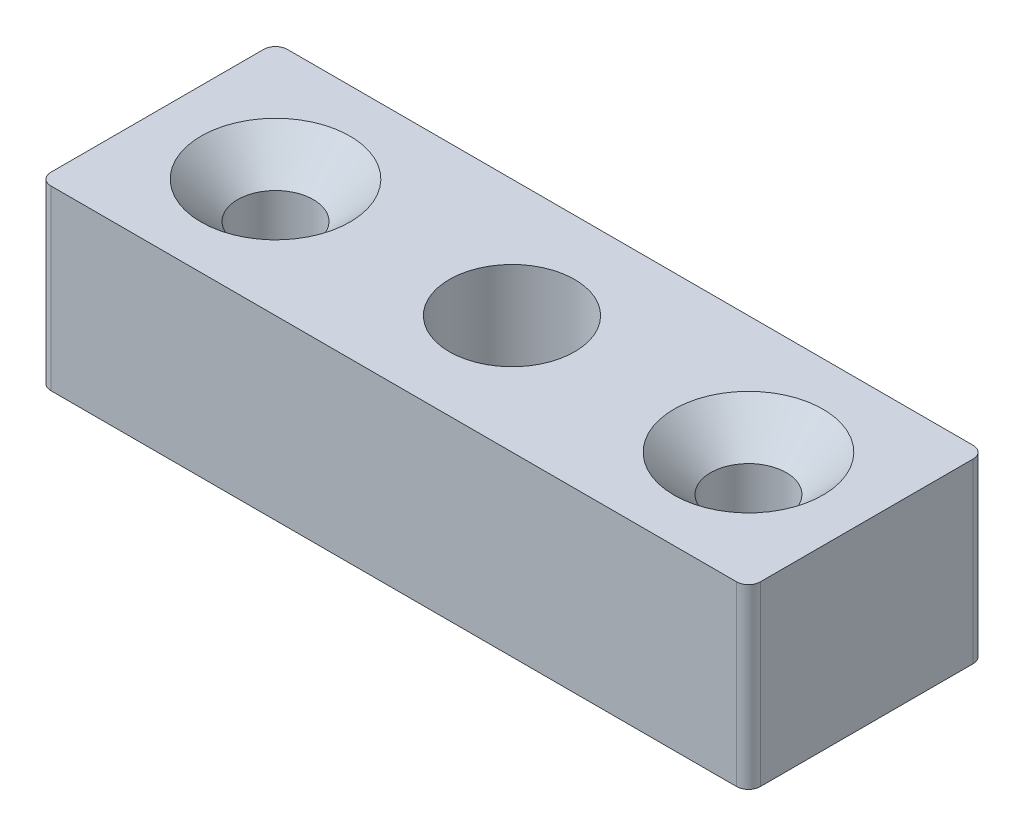
ISO-10303-21;
HEADER;
FILE_DESCRIPTION(('STEP AP214'),'2;1');
FILE_NAME('part.step','',(''),(''),'','','');
FILE_SCHEMA(('AUTOMOTIVE_DESIGN { 1 0 10303 214 1 1 1 1 }'));
ENDSEC;
DATA;
#1=APPLICATION_CONTEXT('core data for automotive mechanical design processes');
#2=APPLICATION_PROTOCOL_DEFINITION('international standard','automotive_design',2000,#1);
#3=PRODUCT_CONTEXT('',#1,'mechanical');
#4=PRODUCT('Part','Part','',(#3));
#5=PRODUCT_RELATED_PRODUCT_CATEGORY('part','',(#4));
#6=PRODUCT_DEFINITION_FORMATION('','',#4);
#7=PRODUCT_DEFINITION_CONTEXT('part definition',#1,'design');
#8=PRODUCT_DEFINITION('design','',#6,#7);
#9=PRODUCT_DEFINITION_SHAPE('','',#8);
#10=(LENGTH_UNIT() NAMED_UNIT(*) SI_UNIT(.MILLI.,.METRE.));
#11=(NAMED_UNIT(*) PLANE_ANGLE_UNIT() SI_UNIT($,.RADIAN.));
#12=(NAMED_UNIT(*) SI_UNIT($,.STERADIAN.) SOLID_ANGLE_UNIT());
#13=UNCERTAINTY_MEASURE_WITH_UNIT(LENGTH_MEASURE(1.E-05),#10,'distance_accuracy_value','');
#14=(GEOMETRIC_REPRESENTATION_CONTEXT(3) GLOBAL_UNCERTAINTY_ASSIGNED_CONTEXT((#13)) GLOBAL_UNIT_ASSIGNED_CONTEXT((#10,
#11,#12)) REPRESENTATION_CONTEXT('',''));
#15=CARTESIAN_POINT('',(0.,0.,0.));
#16=DIRECTION('',(0.,0.,1.));
#17=DIRECTION('',(1.,0.,0.));
#18=AXIS2_PLACEMENT_3D('',#15,#16,#17);
#19=CARTESIAN_POINT('',(-15.,-7.5,-5.));
#20=DIRECTION('',(-1.,0.,0.));
#21=DIRECTION('',(0.,0.,1.));
#22=AXIS2_PLACEMENT_3D('',#19,#20,#21);
#23=PLANE('',#22);
#24=DIRECTION('',(0.,0.,1.));
#25=VECTOR('',#24,1.);
#26=CARTESIAN_POINT('',(-15.,0.,-5.));
#27=LINE('',#26,#25);
#28=CARTESIAN_POINT('',(-15.,0.,-4.5));
#29=VERTEX_POINT('',#28);
#30=CARTESIAN_POINT('',(-15.,0.,4.5));
#31=VERTEX_POINT('',#30);
#32=EDGE_CURVE('E185',#29,#31,#27,.T.);
#33=ORIENTED_EDGE('',*,*,#32,.F.);
#34=DIRECTION('',(0.,1.,0.));
#35=VECTOR('',#34,1.);
#36=CARTESIAN_POINT('',(-15.,-7.5,-4.5));
#37=LINE('',#36,#35);
#38=CARTESIAN_POINT('',(-15.,-7.5,-4.5));
#39=VERTEX_POINT('',#38);
#40=EDGE_CURVE('E155',#29,#39,#37,.F.);
#41=ORIENTED_EDGE('',*,*,#40,.T.);
#42=DIRECTION('',(0.,0.,1.));
#43=VECTOR('',#42,1.);
#44=CARTESIAN_POINT('',(-15.,-7.5,-5.));
#45=LINE('',#44,#43);
#46=CARTESIAN_POINT('',(-15.,-7.5,4.5));
#47=VERTEX_POINT('',#46);
#48=EDGE_CURVE('E129',#39,#47,#45,.T.);
#49=ORIENTED_EDGE('',*,*,#48,.T.);
#50=DIRECTION('',(0.,1.,0.));
#51=VECTOR('',#50,1.);
#52=CARTESIAN_POINT('',(-15.,-7.5,4.5));
#53=LINE('',#52,#51);
#54=EDGE_CURVE('E151',#47,#31,#53,.T.);
#55=ORIENTED_EDGE('',*,*,#54,.T.);
#56=EDGE_LOOP('',(#33,#41,#49,#55));
#57=FACE_BOUND('',#56,.T.);
#58=ADVANCED_FACE('F39',(#57),#23,.T.);
#59=CARTESIAN_POINT('',(-15.,-7.5,-5.));
#60=DIRECTION('',(0.,0.,-1.));
#61=DIRECTION('',(-1.,0.,0.));
#62=AXIS2_PLACEMENT_3D('',#59,#60,#61);
#63=PLANE('',#62);
#64=DIRECTION('',(-1.,0.,0.));
#65=VECTOR('',#64,1.);
#66=CARTESIAN_POINT('',(-15.,-7.5,-5.));
#67=LINE('',#66,#65);
#68=CARTESIAN_POINT('',(14.5,-7.5,-5.));
#69=VERTEX_POINT('',#68);
#70=CARTESIAN_POINT('',(-14.5,-7.5,-5.));
#71=VERTEX_POINT('',#70);
#72=EDGE_CURVE('E135',#69,#71,#67,.T.);
#73=ORIENTED_EDGE('',*,*,#72,.T.);
#74=DIRECTION('',(0.,1.,0.));
#75=VECTOR('',#74,1.);
#76=CARTESIAN_POINT('',(-14.5,-7.5,-5.));
#77=LINE('',#76,#75);
#78=CARTESIAN_POINT('',(-14.5,0.,-5.));
#79=VERTEX_POINT('',#78);
#80=EDGE_CURVE('E127',#71,#79,#77,.T.);
#81=ORIENTED_EDGE('',*,*,#80,.T.);
#82=DIRECTION('',(-1.,0.,0.));
#83=VECTOR('',#82,1.);
#84=CARTESIAN_POINT('',(-15.,0.,-5.));
#85=LINE('',#84,#83);
#86=CARTESIAN_POINT('',(14.5,0.,-5.));
#87=VERTEX_POINT('',#86);
#88=EDGE_CURVE('E109',#87,#79,#85,.T.);
#89=ORIENTED_EDGE('',*,*,#88,.F.);
#90=DIRECTION('',(0.,1.,0.));
#91=VECTOR('',#90,1.);
#92=CARTESIAN_POINT('',(14.5,-7.5,-5.));
#93=LINE('',#92,#91);
#94=EDGE_CURVE('E124',#87,#69,#93,.F.);
#95=ORIENTED_EDGE('',*,*,#94,.T.);
#96=EDGE_LOOP('',(#73,#81,#89,#95));
#97=FACE_BOUND('',#96,.T.);
#98=ADVANCED_FACE('F123',(#97),#63,.T.);
#99=CARTESIAN_POINT('',(15.,-7.5,-5.));
#100=DIRECTION('',(1.,0.,0.));
#101=DIRECTION('',(0.,0.,-1.));
#102=AXIS2_PLACEMENT_3D('',#99,#100,#101);
#103=PLANE('',#102);
#104=DIRECTION('',(0.,0.,-1.));
#105=VECTOR('',#104,1.);
#106=CARTESIAN_POINT('',(15.,-7.5,-5.));
#107=LINE('',#106,#105);
#108=CARTESIAN_POINT('',(15.,-7.5,4.5));
#109=VERTEX_POINT('',#108);
#110=CARTESIAN_POINT('',(15.,-7.5,-4.5));
#111=VERTEX_POINT('',#110);
#112=EDGE_CURVE('E141',#109,#111,#107,.T.);
#113=ORIENTED_EDGE('',*,*,#112,.T.);
#114=DIRECTION('',(0.,1.,0.));
#115=VECTOR('',#114,1.);
#116=CARTESIAN_POINT('',(15.,-7.5,-4.5));
#117=LINE('',#116,#115);
#118=CARTESIAN_POINT('',(15.,0.,-4.5));
#119=VERTEX_POINT('',#118);
#120=EDGE_CURVE('E171',#111,#119,#117,.T.);
#121=ORIENTED_EDGE('',*,*,#120,.T.);
#122=DIRECTION('',(0.,0.,-1.));
#123=VECTOR('',#122,1.);
#124=CARTESIAN_POINT('',(15.,0.,-5.));
#125=LINE('',#124,#123);
#126=CARTESIAN_POINT('',(15.,0.,4.5));
#127=VERTEX_POINT('',#126);
#128=EDGE_CURVE('E111',#127,#119,#125,.T.);
#129=ORIENTED_EDGE('',*,*,#128,.F.);
#130=DIRECTION('',(0.,1.,0.));
#131=VECTOR('',#130,1.);
#132=CARTESIAN_POINT('',(15.,-7.5,4.5));
#133=LINE('',#132,#131);
#134=EDGE_CURVE('E168',#127,#109,#133,.F.);
#135=ORIENTED_EDGE('',*,*,#134,.T.);
#136=EDGE_LOOP('',(#113,#121,#129,#135));
#137=FACE_BOUND('',#136,.T.);
#138=ADVANCED_FACE('F176',(#137),#103,.T.);
#139=CARTESIAN_POINT('',(-15.,-7.5,5.));
#140=DIRECTION('',(0.,0.,1.));
#141=DIRECTION('',(1.,0.,0.));
#142=AXIS2_PLACEMENT_3D('',#139,#140,#141);
#143=PLANE('',#142);
#144=DIRECTION('',(1.,0.,0.));
#145=VECTOR('',#144,1.);
#146=CARTESIAN_POINT('',(-15.,-7.5,5.));
#147=LINE('',#146,#145);
#148=CARTESIAN_POINT('',(-14.5,-7.5,5.));
#149=VERTEX_POINT('',#148);
#150=CARTESIAN_POINT('',(14.5,-7.5,5.));
#151=VERTEX_POINT('',#150);
#152=EDGE_CURVE('E179',#149,#151,#147,.T.);
#153=ORIENTED_EDGE('',*,*,#152,.T.);
#154=DIRECTION('',(0.,1.,0.));
#155=VECTOR('',#154,1.);
#156=CARTESIAN_POINT('',(14.5,-7.5,5.));
#157=LINE('',#156,#155);
#158=CARTESIAN_POINT('',(14.5,0.,5.));
#159=VERTEX_POINT('',#158);
#160=EDGE_CURVE('E11',#151,#159,#157,.T.);
#161=ORIENTED_EDGE('',*,*,#160,.T.);
#162=DIRECTION('',(1.,0.,0.));
#163=VECTOR('',#162,1.);
#164=CARTESIAN_POINT('',(-15.,0.,5.));
#165=LINE('',#164,#163);
#166=CARTESIAN_POINT('',(-14.5,0.,5.));
#167=VERTEX_POINT('',#166);
#168=EDGE_CURVE('E189',#167,#159,#165,.T.);
#169=ORIENTED_EDGE('',*,*,#168,.F.);
#170=DIRECTION('',(0.,1.,0.));
#171=VECTOR('',#170,1.);
#172=CARTESIAN_POINT('',(-14.5,-7.5,5.));
#173=LINE('',#172,#171);
#174=EDGE_CURVE('E48',#167,#149,#173,.F.);
#175=ORIENTED_EDGE('',*,*,#174,.T.);
#176=EDGE_LOOP('',(#153,#161,#169,#175));
#177=FACE_BOUND('',#176,.T.);
#178=ADVANCED_FACE('F237',(#177),#143,.T.);
#179=CARTESIAN_POINT('',(0.,-7.5,0.));
#180=DIRECTION('',(0.,1.,0.));
#181=DIRECTION('',(0.,0.,1.));
#182=AXIS2_PLACEMENT_3D('',#179,#180,#181);
#183=PLANE('',#182);
#184=CARTESIAN_POINT('',(0.,-7.5,0.));
#185=DIRECTION('',(0.,1.,0.));
#186=DIRECTION('',(0.,0.,1.));
#187=AXIS2_PLACEMENT_3D('',#184,#185,#186);
#188=CIRCLE('',#187,2.65);
#189=CARTESIAN_POINT('',(0.,-7.5,2.65));
#190=VERTEX_POINT('',#189);
#191=EDGE_CURVE('E218',#190,#190,#188,.T.);
#192=ORIENTED_EDGE('',*,*,#191,.T.);
#193=EDGE_LOOP('',(#192));
#194=FACE_BOUND('',#193,.T.);
#195=CARTESIAN_POINT('',(-10.,-7.5,0.));
#196=DIRECTION('',(0.,1.,0.));
#197=DIRECTION('',(0.,0.,1.));
#198=AXIS2_PLACEMENT_3D('',#195,#196,#197);
#199=CIRCLE('',#198,1.6);
#200=CARTESIAN_POINT('',(-10.,-7.5,1.6));
#201=VERTEX_POINT('',#200);
#202=EDGE_CURVE('E206',#201,#201,#199,.T.);
#203=ORIENTED_EDGE('',*,*,#202,.T.);
#204=EDGE_LOOP('',(#203));
#205=FACE_BOUND('',#204,.T.);
#206=CARTESIAN_POINT('',(10.,-7.5,0.));
#207=DIRECTION('',(0.,1.,0.));
#208=DIRECTION('',(0.,0.,1.));
#209=AXIS2_PLACEMENT_3D('',#206,#207,#208);
#210=CIRCLE('',#209,1.6);
#211=CARTESIAN_POINT('',(10.,-7.5,1.59999999999999));
#212=VERTEX_POINT('',#211);
#213=EDGE_CURVE('E190',#212,#212,#210,.T.);
#214=ORIENTED_EDGE('',*,*,#213,.T.);
#215=EDGE_LOOP('',(#214));
#216=FACE_BOUND('',#215,.T.);
#217=ORIENTED_EDGE('',*,*,#48,.F.);
#218=CARTESIAN_POINT('',(-14.5,-7.5,-4.5));
#219=DIRECTION('',(0.,1.,0.));
#220=DIRECTION('',(0.,0.,1.));
#221=AXIS2_PLACEMENT_3D('',#218,#219,#220);
#222=CIRCLE('',#221,0.5);
#223=EDGE_CURVE('E165',#39,#71,#222,.F.);
#224=ORIENTED_EDGE('',*,*,#223,.T.);
#225=ORIENTED_EDGE('',*,*,#72,.F.);
#226=CARTESIAN_POINT('',(14.5,-7.5,-4.5));
#227=DIRECTION('',(0.,1.,0.));
#228=DIRECTION('',(0.,0.,1.));
#229=AXIS2_PLACEMENT_3D('',#226,#227,#228);
#230=CIRCLE('',#229,0.5);
#231=EDGE_CURVE('E133',#69,#111,#230,.F.);
#232=ORIENTED_EDGE('',*,*,#231,.T.);
#233=ORIENTED_EDGE('',*,*,#112,.F.);
#234=CARTESIAN_POINT('',(14.5,-7.5,4.5));
#235=DIRECTION('',(0.,1.,0.));
#236=DIRECTION('',(0.,0.,1.));
#237=AXIS2_PLACEMENT_3D('',#234,#235,#236);
#238=CIRCLE('',#237,0.5);
#239=EDGE_CURVE('E55',#109,#151,#238,.F.);
#240=ORIENTED_EDGE('',*,*,#239,.T.);
#241=ORIENTED_EDGE('',*,*,#152,.F.);
#242=CARTESIAN_POINT('',(-14.5,-7.5,4.5));
#243=DIRECTION('',(0.,1.,0.));
#244=DIRECTION('',(0.,0.,1.));
#245=AXIS2_PLACEMENT_3D('',#242,#243,#244);
#246=CIRCLE('',#245,0.5);
#247=EDGE_CURVE('E158',#149,#47,#246,.F.);
#248=ORIENTED_EDGE('',*,*,#247,.T.);
#249=EDGE_LOOP('',(#217,#224,#225,#232,#233,#240,#241,#248));
#250=FACE_BOUND('',#249,.T.);
#251=ADVANCED_FACE('F266',(#194,#205,#216,#250),#183,.F.);
#252=CARTESIAN_POINT('',(0.,0.,0.));
#253=DIRECTION('',(0.,1.,0.));
#254=DIRECTION('',(0.,0.,1.));
#255=AXIS2_PLACEMENT_3D('',#252,#253,#254);
#256=PLANE('',#255);
#257=CARTESIAN_POINT('',(0.,0.,0.));
#258=DIRECTION('',(0.,1.,0.));
#259=DIRECTION('',(0.,0.,1.));
#260=AXIS2_PLACEMENT_3D('',#257,#258,#259);
#261=CIRCLE('',#260,2.65);
#262=CARTESIAN_POINT('',(0.,0.,2.65));
#263=VERTEX_POINT('',#262);
#264=EDGE_CURVE('E222',#263,#263,#261,.T.);
#265=ORIENTED_EDGE('',*,*,#264,.F.);
#266=EDGE_LOOP('',(#265));
#267=FACE_BOUND('',#266,.T.);
#268=CARTESIAN_POINT('',(-10.,0.,0.));
#269=DIRECTION('',(0.,1.,0.));
#270=DIRECTION('',(0.,0.,1.));
#271=AXIS2_PLACEMENT_3D('',#268,#269,#270);
#272=CIRCLE('',#271,3.15);
#273=CARTESIAN_POINT('',(-10.,0.,3.15));
#274=VERTEX_POINT('',#273);
#275=EDGE_CURVE('E214',#274,#274,#272,.T.);
#276=ORIENTED_EDGE('',*,*,#275,.F.);
#277=EDGE_LOOP('',(#276));
#278=FACE_BOUND('',#277,.T.);
#279=CARTESIAN_POINT('',(10.,0.,0.));
#280=DIRECTION('',(0.,1.,0.));
#281=DIRECTION('',(0.,0.,1.));
#282=AXIS2_PLACEMENT_3D('',#279,#280,#281);
#283=CIRCLE('',#282,3.15);
#284=CARTESIAN_POINT('',(10.,0.,3.15));
#285=VERTEX_POINT('',#284);
#286=EDGE_CURVE('E202',#285,#285,#283,.T.);
#287=ORIENTED_EDGE('',*,*,#286,.F.);
#288=EDGE_LOOP('',(#287));
#289=FACE_BOUND('',#288,.T.);
#290=ORIENTED_EDGE('',*,*,#88,.T.);
#291=CARTESIAN_POINT('',(-14.5,0.,-4.5));
#292=DIRECTION('',(0.,1.,0.));
#293=DIRECTION('',(0.,0.,1.));
#294=AXIS2_PLACEMENT_3D('',#291,#292,#293);
#295=CIRCLE('',#294,0.5);
#296=EDGE_CURVE('E117',#79,#29,#295,.T.);
#297=ORIENTED_EDGE('',*,*,#296,.T.);
#298=ORIENTED_EDGE('',*,*,#32,.T.);
#299=CARTESIAN_POINT('',(-14.5,0.,4.5));
#300=DIRECTION('',(0.,1.,0.));
#301=DIRECTION('',(0.,0.,1.));
#302=AXIS2_PLACEMENT_3D('',#299,#300,#301);
#303=CIRCLE('',#302,0.5);
#304=EDGE_CURVE('E139',#31,#167,#303,.T.);
#305=ORIENTED_EDGE('',*,*,#304,.T.);
#306=ORIENTED_EDGE('',*,*,#168,.T.);
#307=CARTESIAN_POINT('',(14.5,0.,4.5));
#308=DIRECTION('',(0.,1.,0.));
#309=DIRECTION('',(0.,0.,1.));
#310=AXIS2_PLACEMENT_3D('',#307,#308,#309);
#311=CIRCLE('',#310,0.5);
#312=EDGE_CURVE('E118',#159,#127,#311,.T.);
#313=ORIENTED_EDGE('',*,*,#312,.T.);
#314=ORIENTED_EDGE('',*,*,#128,.T.);
#315=CARTESIAN_POINT('',(14.5,0.,-4.5));
#316=DIRECTION('',(0.,1.,0.));
#317=DIRECTION('',(0.,0.,1.));
#318=AXIS2_PLACEMENT_3D('',#315,#316,#317);
#319=CIRCLE('',#318,0.5);
#320=EDGE_CURVE('E106',#119,#87,#319,.T.);
#321=ORIENTED_EDGE('',*,*,#320,.T.);
#322=EDGE_LOOP('',(#290,#297,#298,#305,#306,#313,#314,#321));
#323=FACE_BOUND('',#322,.T.);
#324=ADVANCED_FACE('F108',(#267,#278,#289,#323),#256,.T.);
#325=CARTESIAN_POINT('',(10.,0.,0.));
#326=DIRECTION('',(0.,1.,0.));
#327=DIRECTION('',(0.,0.,1.));
#328=AXIS2_PLACEMENT_3D('',#325,#326,#327);
#329=CYLINDRICAL_SURFACE('',#328,1.6);
#330=ORIENTED_EDGE('',*,*,#213,.F.);
#331=EDGE_LOOP('',(#330));
#332=FACE_BOUND('',#331,.T.);
#333=CARTESIAN_POINT('',(10.,-1.55,0.));
#334=DIRECTION('',(0.,1.,0.));
#335=DIRECTION('',(0.,0.,1.));
#336=AXIS2_PLACEMENT_3D('',#333,#334,#335);
#337=CIRCLE('',#336,1.6);
#338=CARTESIAN_POINT('',(10.,-1.55,1.6));
#339=VERTEX_POINT('',#338);
#340=EDGE_CURVE('E198',#339,#339,#337,.T.);
#341=ORIENTED_EDGE('',*,*,#340,.T.);
#342=EDGE_LOOP('',(#341));
#343=FACE_BOUND('',#342,.T.);
#344=ADVANCED_FACE('F274',(#332,#343),#329,.F.);
#345=CARTESIAN_POINT('',(10.,0.,0.));
#346=DIRECTION('',(0.,1.,0.));
#347=DIRECTION('',(0.,0.,1.));
#348=AXIS2_PLACEMENT_3D('',#345,#346,#347);
#349=CONICAL_SURFACE('',#348,3.15,0.785398163397448);
#350=ORIENTED_EDGE('',*,*,#340,.F.);
#351=EDGE_LOOP('',(#350));
#352=FACE_BOUND('',#351,.T.);
#353=ORIENTED_EDGE('',*,*,#286,.T.);
#354=EDGE_LOOP('',(#353));
#355=FACE_BOUND('',#354,.T.);
#356=ADVANCED_FACE('F345',(#352,#355),#349,.F.);
#357=CARTESIAN_POINT('',(-10.,0.,0.));
#358=DIRECTION('',(0.,1.,0.));
#359=DIRECTION('',(0.,0.,1.));
#360=AXIS2_PLACEMENT_3D('',#357,#358,#359);
#361=CYLINDRICAL_SURFACE('',#360,1.6);
#362=ORIENTED_EDGE('',*,*,#202,.F.);
#363=EDGE_LOOP('',(#362));
#364=FACE_BOUND('',#363,.T.);
#365=CARTESIAN_POINT('',(-10.,-1.55,0.));
#366=DIRECTION('',(0.,1.,0.));
#367=DIRECTION('',(0.,0.,1.));
#368=AXIS2_PLACEMENT_3D('',#365,#366,#367);
#369=CIRCLE('',#368,1.6);
#370=CARTESIAN_POINT('',(-10.,-1.55,1.6));
#371=VERTEX_POINT('',#370);
#372=EDGE_CURVE('E210',#371,#371,#369,.T.);
#373=ORIENTED_EDGE('',*,*,#372,.T.);
#374=EDGE_LOOP('',(#373));
#375=FACE_BOUND('',#374,.T.);
#376=ADVANCED_FACE('F336',(#364,#375),#361,.F.);
#377=CARTESIAN_POINT('',(-10.,0.,0.));
#378=DIRECTION('',(0.,1.,0.));
#379=DIRECTION('',(0.,0.,1.));
#380=AXIS2_PLACEMENT_3D('',#377,#378,#379);
#381=CONICAL_SURFACE('',#380,3.15,0.785398163397448);
#382=ORIENTED_EDGE('',*,*,#372,.F.);
#383=EDGE_LOOP('',(#382));
#384=FACE_BOUND('',#383,.T.);
#385=ORIENTED_EDGE('',*,*,#275,.T.);
#386=EDGE_LOOP('',(#385));
#387=FACE_BOUND('',#386,.T.);
#388=ADVANCED_FACE('F263',(#384,#387),#381,.F.);
#389=CARTESIAN_POINT('',(0.,0.,0.));
#390=DIRECTION('',(0.,1.,0.));
#391=DIRECTION('',(0.,0.,1.));
#392=AXIS2_PLACEMENT_3D('',#389,#390,#391);
#393=CYLINDRICAL_SURFACE('',#392,2.65);
#394=ORIENTED_EDGE('',*,*,#191,.F.);
#395=EDGE_LOOP('',(#394));
#396=FACE_BOUND('',#395,.T.);
#397=ORIENTED_EDGE('',*,*,#264,.T.);
#398=EDGE_LOOP('',(#397));
#399=FACE_BOUND('',#398,.T.);
#400=ADVANCED_FACE('F258',(#396,#399),#393,.F.);
#401=CARTESIAN_POINT('',(-14.5,-7.5,-4.5));
#402=DIRECTION('',(0.,1.,0.));
#403=DIRECTION('',(0.,0.,1.));
#404=AXIS2_PLACEMENT_3D('',#401,#402,#403);
#405=CYLINDRICAL_SURFACE('',#404,0.5);
#406=ORIENTED_EDGE('',*,*,#223,.F.);
#407=ORIENTED_EDGE('',*,*,#40,.F.);
#408=ORIENTED_EDGE('',*,*,#296,.F.);
#409=ORIENTED_EDGE('',*,*,#80,.F.);
#410=EDGE_LOOP('',(#406,#407,#408,#409));
#411=FACE_BOUND('',#410,.T.);
#412=ADVANCED_FACE('F246',(#411),#405,.T.);
#413=CARTESIAN_POINT('',(14.5,-7.5,-4.5));
#414=DIRECTION('',(0.,1.,0.));
#415=DIRECTION('',(0.,0.,1.));
#416=AXIS2_PLACEMENT_3D('',#413,#414,#415);
#417=CYLINDRICAL_SURFACE('',#416,0.5);
#418=ORIENTED_EDGE('',*,*,#231,.F.);
#419=ORIENTED_EDGE('',*,*,#94,.F.);
#420=ORIENTED_EDGE('',*,*,#320,.F.);
#421=ORIENTED_EDGE('',*,*,#120,.F.);
#422=EDGE_LOOP('',(#418,#419,#420,#421));
#423=FACE_BOUND('',#422,.T.);
#424=ADVANCED_FACE('F132',(#423),#417,.T.);
#425=CARTESIAN_POINT('',(14.5,-7.5,4.5));
#426=DIRECTION('',(0.,1.,0.));
#427=DIRECTION('',(0.,0.,1.));
#428=AXIS2_PLACEMENT_3D('',#425,#426,#427);
#429=CYLINDRICAL_SURFACE('',#428,0.5);
#430=ORIENTED_EDGE('',*,*,#239,.F.);
#431=ORIENTED_EDGE('',*,*,#134,.F.);
#432=ORIENTED_EDGE('',*,*,#312,.F.);
#433=ORIENTED_EDGE('',*,*,#160,.F.);
#434=EDGE_LOOP('',(#430,#431,#432,#433));
#435=FACE_BOUND('',#434,.T.);
#436=ADVANCED_FACE('F240',(#435),#429,.T.);
#437=CARTESIAN_POINT('',(-14.5,-7.5,4.5));
#438=DIRECTION('',(0.,1.,0.));
#439=DIRECTION('',(0.,0.,1.));
#440=AXIS2_PLACEMENT_3D('',#437,#438,#439);
#441=CYLINDRICAL_SURFACE('',#440,0.5);
#442=ORIENTED_EDGE('',*,*,#247,.F.);
#443=ORIENTED_EDGE('',*,*,#174,.F.);
#444=ORIENTED_EDGE('',*,*,#304,.F.);
#445=ORIENTED_EDGE('',*,*,#54,.F.);
#446=EDGE_LOOP('',(#442,#443,#444,#445));
#447=FACE_BOUND('',#446,.T.);
#448=ADVANCED_FACE('F41',(#447),#441,.T.);
#449=CLOSED_SHELL('',(#58,#98,#138,#178,#251,#324,#344,#356,#376,#388,#400,#412,#424,#436,#448));
#450=MANIFOLD_SOLID_BREP('B2',#449);
#451=ADVANCED_BREP_SHAPE_REPRESENTATION('',(#18,#450),#14);
#452=SHAPE_DEFINITION_REPRESENTATION(#9,#451);
ENDSEC;
END-ISO-10303-21;
